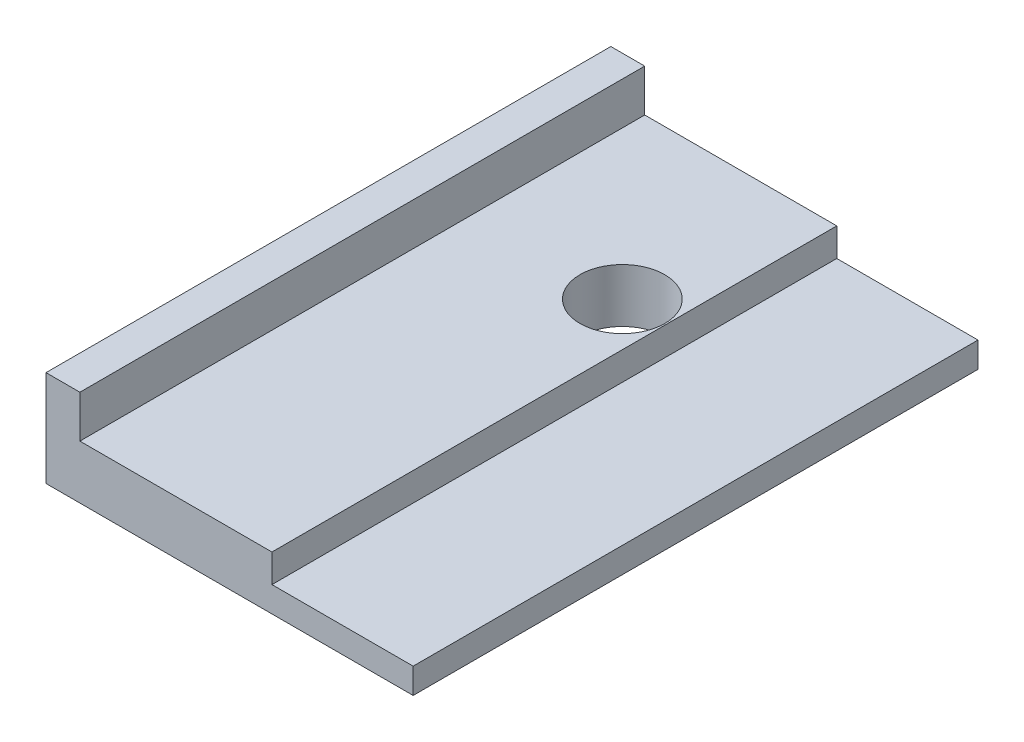
ISO-10303-21;
HEADER;
FILE_DESCRIPTION(('STEP AP214'),'2;1');
FILE_NAME('part.step','',(''),(''),'','','');
FILE_SCHEMA(('AUTOMOTIVE_DESIGN { 1 0 10303 214 1 1 1 1 }'));
ENDSEC;
DATA;
#1=APPLICATION_CONTEXT('core data for automotive mechanical design processes');
#2=APPLICATION_PROTOCOL_DEFINITION('international standard','automotive_design',2000,#1);
#3=PRODUCT_CONTEXT('',#1,'mechanical');
#4=PRODUCT('Part','Part','',(#3));
#5=PRODUCT_RELATED_PRODUCT_CATEGORY('part','',(#4));
#6=PRODUCT_DEFINITION_FORMATION('','',#4);
#7=PRODUCT_DEFINITION_CONTEXT('part definition',#1,'design');
#8=PRODUCT_DEFINITION('design','',#6,#7);
#9=PRODUCT_DEFINITION_SHAPE('','',#8);
#10=(LENGTH_UNIT() NAMED_UNIT(*) SI_UNIT(.MILLI.,.METRE.));
#11=(NAMED_UNIT(*) PLANE_ANGLE_UNIT() SI_UNIT($,.RADIAN.));
#12=(NAMED_UNIT(*) SI_UNIT($,.STERADIAN.) SOLID_ANGLE_UNIT());
#13=UNCERTAINTY_MEASURE_WITH_UNIT(LENGTH_MEASURE(1.E-05),#10,'distance_accuracy_value','');
#14=(GEOMETRIC_REPRESENTATION_CONTEXT(3) GLOBAL_UNCERTAINTY_ASSIGNED_CONTEXT((#13)) GLOBAL_UNIT_ASSIGNED_CONTEXT((#10,
#11,#12)) REPRESENTATION_CONTEXT('',''));
#15=CARTESIAN_POINT('',(0.,0.,0.));
#16=DIRECTION('',(0.,0.,1.));
#17=DIRECTION('',(1.,0.,0.));
#18=AXIS2_PLACEMENT_3D('',#15,#16,#17);
#19=CARTESIAN_POINT('',(-71.7682926829268,10.2317073170732,0.));
#20=DIRECTION('',(0.,0.,1.));
#21=DIRECTION('',(1.,0.,0.));
#22=AXIS2_PLACEMENT_3D('',#19,#20,#21);
#23=PLANE('',#22);
#24=DIRECTION('',(1.,0.,0.));
#25=VECTOR('',#24,1.);
#26=CARTESIAN_POINT('',(-48.3841463414634,9.,0.));
#27=LINE('',#26,#25);
#28=CARTESIAN_POINT('',(-50.,9.,0.));
#29=VERTEX_POINT('',#28);
#30=CARTESIAN_POINT('',(0.,9.,0.));
#31=VERTEX_POINT('',#30);
#32=EDGE_CURVE('E182',#29,#31,#27,.T.);
#33=ORIENTED_EDGE('',*,*,#32,.T.);
#34=DIRECTION('',(0.,-1.,0.));
#35=VECTOR('',#34,1.);
#36=CARTESIAN_POINT('',(0.,10.,0.));
#37=LINE('',#36,#35);
#38=CARTESIAN_POINT('',(0.,0.,0.));
#39=VERTEX_POINT('',#38);
#40=EDGE_CURVE('E139',#31,#39,#37,.T.);
#41=ORIENTED_EDGE('',*,*,#40,.T.);
#42=DIRECTION('',(-1.,0.,0.));
#43=VECTOR('',#42,1.);
#44=CARTESIAN_POINT('',(0.,0.,0.));
#45=LINE('',#44,#43);
#46=CARTESIAN_POINT('',(-130.,0.,0.));
#47=VERTEX_POINT('',#46);
#48=EDGE_CURVE('E11',#39,#47,#45,.T.);
#49=ORIENTED_EDGE('',*,*,#48,.T.);
#50=DIRECTION('',(0.,1.,0.));
#51=VECTOR('',#50,1.);
#52=CARTESIAN_POINT('',(-130.,0.,0.));
#53=LINE('',#52,#51);
#54=CARTESIAN_POINT('',(-130.,34.,0.));
#55=VERTEX_POINT('',#54);
#56=EDGE_CURVE('E138',#47,#55,#53,.T.);
#57=ORIENTED_EDGE('',*,*,#56,.T.);
#58=DIRECTION('',(1.,0.,0.));
#59=VECTOR('',#58,1.);
#60=CARTESIAN_POINT('',(-130.,34.,0.));
#61=LINE('',#60,#59);
#62=CARTESIAN_POINT('',(-118.,34.,0.));
#63=VERTEX_POINT('',#62);
#64=EDGE_CURVE('E159',#55,#63,#61,.T.);
#65=ORIENTED_EDGE('',*,*,#64,.T.);
#66=DIRECTION('',(0.,-1.,0.));
#67=VECTOR('',#66,1.);
#68=CARTESIAN_POINT('',(-118.,34.,0.));
#69=LINE('',#68,#67);
#70=CARTESIAN_POINT('',(-118.,19.,0.));
#71=VERTEX_POINT('',#70);
#72=EDGE_CURVE('E165',#63,#71,#69,.T.);
#73=ORIENTED_EDGE('',*,*,#72,.T.);
#74=DIRECTION('',(1.,0.,0.));
#75=VECTOR('',#74,1.);
#76=CARTESIAN_POINT('',(-118.,19.,0.));
#77=LINE('',#76,#75);
#78=CARTESIAN_POINT('',(-50.,19.,0.));
#79=VERTEX_POINT('',#78);
#80=EDGE_CURVE('E172',#71,#79,#77,.T.);
#81=ORIENTED_EDGE('',*,*,#80,.T.);
#82=DIRECTION('',(0.,-1.,0.));
#83=VECTOR('',#82,1.);
#84=CARTESIAN_POINT('',(-50.,19.,0.));
#85=LINE('',#84,#83);
#86=EDGE_CURVE('E63',#79,#29,#85,.T.);
#87=ORIENTED_EDGE('',*,*,#86,.T.);
#88=EDGE_LOOP('',(#33,#41,#49,#57,#65,#73,#81,#87));
#89=FACE_BOUND('',#88,.T.);
#90=ADVANCED_FACE('F53',(#89),#23,.F.);
#91=CARTESIAN_POINT('',(-130.,0.,0.));
#92=DIRECTION('',(0.,-1.,0.));
#93=DIRECTION('',(0.,0.,-1.));
#94=AXIS2_PLACEMENT_3D('',#91,#92,#93);
#95=PLANE('',#94);
#96=CARTESIAN_POINT('',(-65.5113009171603,0.,60.4110788653094));
#97=DIRECTION('',(0.,-1.,0.));
#98=DIRECTION('',(0.,0.,-1.));
#99=AXIS2_PLACEMENT_3D('',#96,#97,#98);
#100=CIRCLE('',#99,15.);
#101=CARTESIAN_POINT('',(-65.5113009171603,0.,45.4110788653094));
#102=VERTEX_POINT('',#101);
#103=EDGE_CURVE('E208',#102,#102,#100,.T.);
#104=ORIENTED_EDGE('',*,*,#103,.F.);
#105=EDGE_LOOP('',(#104));
#106=FACE_BOUND('',#105,.T.);
#107=ORIENTED_EDGE('',*,*,#48,.F.);
#108=DIRECTION('',(0.,0.,1.));
#109=VECTOR('',#108,1.);
#110=CARTESIAN_POINT('',(0.,0.,0.));
#111=LINE('',#110,#109);
#112=CARTESIAN_POINT('',(0.,0.,200.));
#113=VERTEX_POINT('',#112);
#114=EDGE_CURVE('E221',#39,#113,#111,.T.);
#115=ORIENTED_EDGE('',*,*,#114,.T.);
#116=DIRECTION('',(1.,0.,0.));
#117=VECTOR('',#116,1.);
#118=CARTESIAN_POINT('',(0.,0.,200.));
#119=LINE('',#118,#117);
#120=CARTESIAN_POINT('',(-130.,0.,200.));
#121=VERTEX_POINT('',#120);
#122=EDGE_CURVE('E144',#121,#113,#119,.T.);
#123=ORIENTED_EDGE('',*,*,#122,.F.);
#124=DIRECTION('',(0.,0.,1.));
#125=VECTOR('',#124,1.);
#126=CARTESIAN_POINT('',(-130.,0.,0.));
#127=LINE('',#126,#125);
#128=EDGE_CURVE('E128',#47,#121,#127,.T.);
#129=ORIENTED_EDGE('',*,*,#128,.F.);
#130=EDGE_LOOP('',(#107,#115,#123,#129));
#131=FACE_BOUND('',#130,.T.);
#132=ADVANCED_FACE('F143',(#106,#131),#95,.T.);
#133=CARTESIAN_POINT('',(-50.,10.,0.));
#134=DIRECTION('',(1.,0.,0.));
#135=DIRECTION('',(0.,1.,0.));
#136=AXIS2_PLACEMENT_3D('',#133,#134,#135);
#137=PLANE('',#136);
#138=ORIENTED_EDGE('',*,*,#86,.F.);
#139=DIRECTION('',(0.,0.,1.));
#140=VECTOR('',#139,1.);
#141=CARTESIAN_POINT('',(-50.,19.,0.));
#142=LINE('',#141,#140);
#143=CARTESIAN_POINT('',(-50.,19.,200.));
#144=VERTEX_POINT('',#143);
#145=EDGE_CURVE('E176',#79,#144,#142,.T.);
#146=ORIENTED_EDGE('',*,*,#145,.T.);
#147=DIRECTION('',(0.,1.,0.));
#148=VECTOR('',#147,1.);
#149=CARTESIAN_POINT('',(-50.,10.1158536585366,200.));
#150=LINE('',#149,#148);
#151=CARTESIAN_POINT('',(-50.,9.,200.));
#152=VERTEX_POINT('',#151);
#153=EDGE_CURVE('E198',#152,#144,#150,.T.);
#154=ORIENTED_EDGE('',*,*,#153,.F.);
#155=DIRECTION('',(0.,0.,-1.));
#156=VECTOR('',#155,1.);
#157=CARTESIAN_POINT('',(-50.,9.,0.));
#158=LINE('',#157,#156);
#159=EDGE_CURVE('E189',#152,#29,#158,.T.);
#160=ORIENTED_EDGE('',*,*,#159,.T.);
#161=EDGE_LOOP('',(#138,#146,#154,#160));
#162=FACE_BOUND('',#161,.T.);
#163=ADVANCED_FACE('F196',(#162),#137,.T.);
#164=CARTESIAN_POINT('',(-50.,19.,0.));
#165=DIRECTION('',(0.,1.,0.));
#166=DIRECTION('',(1.,0.,0.));
#167=AXIS2_PLACEMENT_3D('',#164,#165,#166);
#168=PLANE('',#167);
#169=CARTESIAN_POINT('',(-65.5113009171603,19.,60.4110788653094));
#170=DIRECTION('',(0.,1.,0.));
#171=DIRECTION('',(0.,0.,1.));
#172=AXIS2_PLACEMENT_3D('',#169,#170,#171);
#173=CIRCLE('',#172,15.);
#174=CARTESIAN_POINT('',(-65.5113009171603,19.,75.4110788653094));
#175=VERTEX_POINT('',#174);
#176=EDGE_CURVE('E56',#175,#175,#173,.T.);
#177=ORIENTED_EDGE('',*,*,#176,.F.);
#178=EDGE_LOOP('',(#177));
#179=FACE_BOUND('',#178,.T.);
#180=ORIENTED_EDGE('',*,*,#80,.F.);
#181=DIRECTION('',(0.,0.,1.));
#182=VECTOR('',#181,1.);
#183=CARTESIAN_POINT('',(-118.,19.,0.));
#184=LINE('',#183,#182);
#185=CARTESIAN_POINT('',(-118.,19.,200.));
#186=VERTEX_POINT('',#185);
#187=EDGE_CURVE('E169',#71,#186,#184,.T.);
#188=ORIENTED_EDGE('',*,*,#187,.T.);
#189=DIRECTION('',(-1.,0.,0.));
#190=VECTOR('',#189,1.);
#191=CARTESIAN_POINT('',(-118.,19.,200.));
#192=LINE('',#191,#190);
#193=EDGE_CURVE('E225',#144,#186,#192,.T.);
#194=ORIENTED_EDGE('',*,*,#193,.F.);
#195=ORIENTED_EDGE('',*,*,#145,.F.);
#196=EDGE_LOOP('',(#180,#188,#194,#195));
#197=FACE_BOUND('',#196,.T.);
#198=ADVANCED_FACE('F248',(#179,#197),#168,.T.);
#199=CARTESIAN_POINT('',(-118.,19.,0.));
#200=DIRECTION('',(1.,0.,0.));
#201=DIRECTION('',(0.,1.,0.));
#202=AXIS2_PLACEMENT_3D('',#199,#200,#201);
#203=PLANE('',#202);
#204=ORIENTED_EDGE('',*,*,#72,.F.);
#205=DIRECTION('',(0.,0.,1.));
#206=VECTOR('',#205,1.);
#207=CARTESIAN_POINT('',(-118.,34.,0.));
#208=LINE('',#207,#206);
#209=CARTESIAN_POINT('',(-118.,34.,200.));
#210=VERTEX_POINT('',#209);
#211=EDGE_CURVE('E162',#63,#210,#208,.T.);
#212=ORIENTED_EDGE('',*,*,#211,.T.);
#213=DIRECTION('',(0.,1.,0.));
#214=VECTOR('',#213,1.);
#215=CARTESIAN_POINT('',(-118.,34.,200.));
#216=LINE('',#215,#214);
#217=EDGE_CURVE('E215',#186,#210,#216,.T.);
#218=ORIENTED_EDGE('',*,*,#217,.F.);
#219=ORIENTED_EDGE('',*,*,#187,.F.);
#220=EDGE_LOOP('',(#204,#212,#218,#219));
#221=FACE_BOUND('',#220,.T.);
#222=ADVANCED_FACE('F246',(#221),#203,.T.);
#223=CARTESIAN_POINT('',(-118.,34.,0.));
#224=DIRECTION('',(0.,1.,0.));
#225=DIRECTION('',(1.,0.,0.));
#226=AXIS2_PLACEMENT_3D('',#223,#224,#225);
#227=PLANE('',#226);
#228=ORIENTED_EDGE('',*,*,#64,.F.);
#229=DIRECTION('',(0.,0.,1.));
#230=VECTOR('',#229,1.);
#231=CARTESIAN_POINT('',(-130.,34.,0.));
#232=LINE('',#231,#230);
#233=CARTESIAN_POINT('',(-130.,34.,200.));
#234=VERTEX_POINT('',#233);
#235=EDGE_CURVE('E147',#55,#234,#232,.T.);
#236=ORIENTED_EDGE('',*,*,#235,.T.);
#237=DIRECTION('',(-1.,0.,0.));
#238=VECTOR('',#237,1.);
#239=CARTESIAN_POINT('',(-130.,34.,200.));
#240=LINE('',#239,#238);
#241=EDGE_CURVE('E212',#210,#234,#240,.T.);
#242=ORIENTED_EDGE('',*,*,#241,.F.);
#243=ORIENTED_EDGE('',*,*,#211,.F.);
#244=EDGE_LOOP('',(#228,#236,#242,#243));
#245=FACE_BOUND('',#244,.T.);
#246=ADVANCED_FACE('F238',(#245),#227,.T.);
#247=CARTESIAN_POINT('',(-130.,34.,0.));
#248=DIRECTION('',(-1.,0.,0.));
#249=DIRECTION('',(0.,0.,1.));
#250=AXIS2_PLACEMENT_3D('',#247,#248,#249);
#251=PLANE('',#250);
#252=ORIENTED_EDGE('',*,*,#56,.F.);
#253=ORIENTED_EDGE('',*,*,#128,.T.);
#254=DIRECTION('',(0.,-1.,0.));
#255=VECTOR('',#254,1.);
#256=CARTESIAN_POINT('',(-130.,0.,200.));
#257=LINE('',#256,#255);
#258=EDGE_CURVE('E155',#234,#121,#257,.T.);
#259=ORIENTED_EDGE('',*,*,#258,.F.);
#260=ORIENTED_EDGE('',*,*,#235,.F.);
#261=EDGE_LOOP('',(#252,#253,#259,#260));
#262=FACE_BOUND('',#261,.T.);
#263=ADVANCED_FACE('F150',(#262),#251,.T.);
#264=CARTESIAN_POINT('',(-71.7682926829268,10.2317073170732,200.));
#265=DIRECTION('',(0.,0.,1.));
#266=DIRECTION('',(1.,0.,0.));
#267=AXIS2_PLACEMENT_3D('',#264,#265,#266);
#268=PLANE('',#267);
#269=DIRECTION('',(-1.,0.,0.));
#270=VECTOR('',#269,1.);
#271=CARTESIAN_POINT('',(-48.3841463414634,9.,200.));
#272=LINE('',#271,#270);
#273=CARTESIAN_POINT('',(0.,9.,200.));
#274=VERTEX_POINT('',#273);
#275=EDGE_CURVE('E201',#274,#152,#272,.T.);
#276=ORIENTED_EDGE('',*,*,#275,.T.);
#277=ORIENTED_EDGE('',*,*,#153,.T.);
#278=ORIENTED_EDGE('',*,*,#193,.T.);
#279=ORIENTED_EDGE('',*,*,#217,.T.);
#280=ORIENTED_EDGE('',*,*,#241,.T.);
#281=ORIENTED_EDGE('',*,*,#258,.T.);
#282=ORIENTED_EDGE('',*,*,#122,.T.);
#283=DIRECTION('',(0.,1.,0.));
#284=VECTOR('',#283,1.);
#285=CARTESIAN_POINT('',(0.,10.,200.));
#286=LINE('',#285,#284);
#287=EDGE_CURVE('E193',#113,#274,#286,.T.);
#288=ORIENTED_EDGE('',*,*,#287,.T.);
#289=EDGE_LOOP('',(#276,#277,#278,#279,#280,#281,#282,#288));
#290=FACE_BOUND('',#289,.T.);
#291=ADVANCED_FACE('F241',(#290),#268,.T.);
#292=CARTESIAN_POINT('',(0.,0.,0.));
#293=DIRECTION('',(1.,0.,0.));
#294=DIRECTION('',(0.,1.,0.));
#295=AXIS2_PLACEMENT_3D('',#292,#293,#294);
#296=PLANE('',#295);
#297=DIRECTION('',(0.,0.,1.));
#298=VECTOR('',#297,1.);
#299=CARTESIAN_POINT('',(0.,9.,50.));
#300=LINE('',#299,#298);
#301=EDGE_CURVE('E191',#31,#274,#300,.T.);
#302=ORIENTED_EDGE('',*,*,#301,.T.);
#303=ORIENTED_EDGE('',*,*,#287,.F.);
#304=ORIENTED_EDGE('',*,*,#114,.F.);
#305=ORIENTED_EDGE('',*,*,#40,.F.);
#306=EDGE_LOOP('',(#302,#303,#304,#305));
#307=FACE_BOUND('',#306,.T.);
#308=ADVANCED_FACE('F300',(#307),#296,.T.);
#309=CARTESIAN_POINT('',(-25.,9.,100.));
#310=DIRECTION('',(0.,-1.,0.));
#311=DIRECTION('',(0.,0.,-1.));
#312=AXIS2_PLACEMENT_3D('',#309,#310,#311);
#313=PLANE('',#312);
#314=ORIENTED_EDGE('',*,*,#159,.F.);
#315=ORIENTED_EDGE('',*,*,#275,.F.);
#316=ORIENTED_EDGE('',*,*,#301,.F.);
#317=ORIENTED_EDGE('',*,*,#32,.F.);
#318=EDGE_LOOP('',(#314,#315,#316,#317));
#319=FACE_BOUND('',#318,.T.);
#320=ADVANCED_FACE('F187',(#319),#313,.F.);
#321=CARTESIAN_POINT('',(-65.5113009171603,34.,60.4110788653094));
#322=DIRECTION('',(0.,-1.,0.));
#323=DIRECTION('',(0.,0.,-1.));
#324=AXIS2_PLACEMENT_3D('',#321,#322,#323);
#325=CYLINDRICAL_SURFACE('',#324,15.);
#326=ORIENTED_EDGE('',*,*,#176,.T.);
#327=EDGE_LOOP('',(#326));
#328=FACE_BOUND('',#327,.T.);
#329=ORIENTED_EDGE('',*,*,#103,.T.);
#330=EDGE_LOOP('',(#329));
#331=FACE_BOUND('',#330,.T.);
#332=ADVANCED_FACE('F299',(#328,#331),#325,.F.);
#333=CLOSED_SHELL('',(#90,#132,#163,#198,#222,#246,#263,#291,#308,#320,#332));
#334=MANIFOLD_SOLID_BREP('B2',#333);
#335=ADVANCED_BREP_SHAPE_REPRESENTATION('',(#18,#334),#14);
#336=SHAPE_DEFINITION_REPRESENTATION(#9,#335);
ENDSEC;
END-ISO-10303-21;
